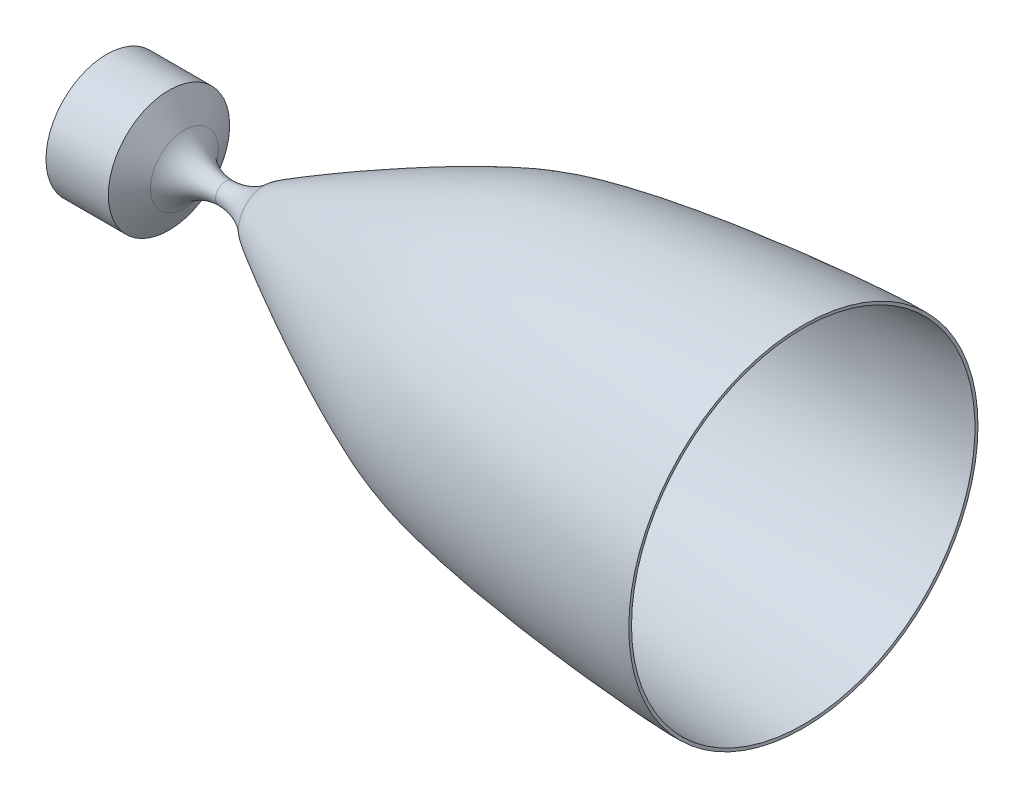
ISO-10303-21;
HEADER;
FILE_DESCRIPTION(('STEP AP214'),'2;1');
FILE_NAME('part.step','',(''),(''),'','','');
FILE_SCHEMA(('AUTOMOTIVE_DESIGN { 1 0 10303 214 1 1 1 1 }'));
ENDSEC;
DATA;
#1=APPLICATION_CONTEXT('core data for automotive mechanical design processes');
#2=APPLICATION_PROTOCOL_DEFINITION('international standard','automotive_design',2000,#1);
#3=PRODUCT_CONTEXT('',#1,'mechanical');
#4=PRODUCT('Part','Part','',(#3));
#5=PRODUCT_RELATED_PRODUCT_CATEGORY('part','',(#4));
#6=PRODUCT_DEFINITION_FORMATION('','',#4);
#7=PRODUCT_DEFINITION_CONTEXT('part definition',#1,'design');
#8=PRODUCT_DEFINITION('design','',#6,#7);
#9=PRODUCT_DEFINITION_SHAPE('','',#8);
#10=(LENGTH_UNIT() NAMED_UNIT(*) SI_UNIT(.MILLI.,.METRE.));
#11=(NAMED_UNIT(*) PLANE_ANGLE_UNIT() SI_UNIT($,.RADIAN.));
#12=(NAMED_UNIT(*) SI_UNIT($,.STERADIAN.) SOLID_ANGLE_UNIT());
#13=UNCERTAINTY_MEASURE_WITH_UNIT(LENGTH_MEASURE(1.E-05),#10,'distance_accuracy_value','');
#14=(GEOMETRIC_REPRESENTATION_CONTEXT(3) GLOBAL_UNCERTAINTY_ASSIGNED_CONTEXT((#13)) GLOBAL_UNIT_ASSIGNED_CONTEXT((#10,
#11,#12)) REPRESENTATION_CONTEXT('',''));
#15=CARTESIAN_POINT('',(0.,0.,0.));
#16=DIRECTION('',(0.,0.,1.));
#17=DIRECTION('',(1.,0.,0.));
#18=AXIS2_PLACEMENT_3D('',#15,#16,#17);
#19=CARTESIAN_POINT('',(-104.819362446718,10.4016129521982,-0.00682647062281705));
#20=CARTESIAN_POINT('',(-103.030535876208,12.1904395227085,-0.00682647062281705));
#21=CARTESIAN_POINT('',(-50.7120404188927,41.7307623696391,-0.00682647062281705));
#22=CARTESIAN_POINT('',(21.1334793033363,68.306603235571,-0.00682647062281705));
#23=CARTESIAN_POINT('',(117.784236763693,74.514625061371,-0.00682647062281705));
#24=CARTESIAN_POINT('',(126.48632550548,74.0001965417168,-0.00682647062281705));
#25=B_SPLINE_CURVE_WITH_KNOTS('',3,(#19,#20,#21,#22,#23,#24),.UNSPECIFIED.,.F.,.F.,(4,1,1,4),
(0.,0.463825258153159,0.563825258153159,1.),.UNSPECIFIED.);
#26=CARTESIAN_POINT('',(-122.41967449452,0.,-0.00682647062281705));
#27=DIRECTION('',(-1.,0.,0.));
#28=AXIS1_PLACEMENT('',#26,#27);
#29=SURFACE_OF_REVOLUTION('',#25,#28);
#30=CARTESIAN_POINT('',(126.48632550548,0.,-0.00682647062281705));
#31=DIRECTION('',(-1.,0.,0.));
#32=DIRECTION('',(0.,0.,1.));
#33=AXIS2_PLACEMENT_3D('',#30,#31,#32);
#34=CIRCLE('',#33,74.0001965417168);
#35=CARTESIAN_POINT('',(126.48632550548,0.,73.993370071094));
#36=VERTEX_POINT('',#35);
#37=EDGE_CURVE('E10',#36,#36,#34,.T.);
#38=ORIENTED_EDGE('',*,*,#37,.F.);
#39=EDGE_LOOP('',(#38));
#40=FACE_BOUND('',#39,.T.);
#41=CARTESIAN_POINT('',(-104.819362446718,0.,-0.00682647062281705));
#42=DIRECTION('',(-1.,0.,0.));
#43=DIRECTION('',(0.,0.,1.));
#44=AXIS2_PLACEMENT_3D('',#41,#42,#43);
#45=CIRCLE('',#44,10.4016129521982);
#46=CARTESIAN_POINT('',(-104.819362446718,0.,10.3947864815753));
#47=VERTEX_POINT('',#46);
#48=EDGE_CURVE('E78',#47,#47,#45,.T.);
#49=ORIENTED_EDGE('',*,*,#48,.T.);
#50=EDGE_LOOP('',(#49));
#51=FACE_BOUND('',#50,.T.);
#52=ADVANCED_FACE('F37',(#40,#51),#29,.T.);
#53=CARTESIAN_POINT('',(126.559768329868,0.,-0.00682647062281705));
#54=DIRECTION('',(1.,0.,0.));
#55=DIRECTION('',(0.,0.,-1.));
#56=AXIS2_PLACEMENT_3D('',#53,#54,#55);
#57=CONICAL_SURFACE('',#56,75.2425576295033,1.51174952321418);
#58=ORIENTED_EDGE('',*,*,#37,.T.);
#59=EDGE_LOOP('',(#58));
#60=FACE_BOUND('',#59,.T.);
#61=CARTESIAN_POINT('',(126.559768329868,0.,-0.00682647062281705));
#62=DIRECTION('',(-1.,0.,0.));
#63=DIRECTION('',(0.,0.,1.));
#64=AXIS2_PLACEMENT_3D('',#61,#62,#63);
#65=CIRCLE('',#64,75.2425576295033);
#66=CARTESIAN_POINT('',(126.559768329868,0.,75.2357311588805));
#67=VERTEX_POINT('',#66);
#68=EDGE_CURVE('E44',#67,#67,#65,.T.);
#69=ORIENTED_EDGE('',*,*,#68,.F.);
#70=EDGE_LOOP('',(#69));
#71=FACE_BOUND('',#70,.T.);
#72=ADVANCED_FACE('F95',(#60,#71),#57,.F.);
#73=CARTESIAN_POINT('',(-105.699378049108,11.2816285545882,-0.00682647062281705));
#74=CARTESIAN_POINT('',(-105.53560430475,11.4454022989468,-0.00682647062281705));
#75=CARTESIAN_POINT('',(-105.406049169845,11.538226175498,-0.00682647062281705));
#76=CARTESIAN_POINT('',(-105.054275376034,11.7930691544197,-0.00682647062281705));
#77=CARTESIAN_POINT('',(-104.844420032022,11.9359369193943,-0.00682647062281705));
#78=CARTESIAN_POINT('',(-104.093090410319,12.4290450422113,-0.00682647062281705));
#79=CARTESIAN_POINT('',(-103.431437659706,12.8419973292261,-0.00682647062281705));
#80=CARTESIAN_POINT('',(-100.979174422802,14.3258551655117,-0.00682647062281705));
#81=CARTESIAN_POINT('',(-98.7244853193859,15.6390993898248,-0.00682647062281705));
#82=CARTESIAN_POINT('',(-90.4370513081206,20.3297007083064,-0.00682647062281705));
#83=CARTESIAN_POINT('',(-82.8843851025847,24.455569333345,-0.00682647062281705));
#84=CARTESIAN_POINT('',(-65.6377591537292,33.445690479554,-0.00682647062281705));
#85=CARTESIAN_POINT('',(-55.9447513733205,38.3094291781832,-0.00682647062281705));
#86=CARTESIAN_POINT('',(-41.2400575868185,45.21025982028,-0.00682647062281705));
#87=CARTESIAN_POINT('',(-36.310942870987,47.4447439954849,-0.00682647062281705));
#88=CARTESIAN_POINT('',(-29.0549175657587,50.5794714256805,-0.00682647062281705));
#89=CARTESIAN_POINT('',(-26.6617075823191,51.5876151131051,-0.00682647062281705));
#90=CARTESIAN_POINT('',(-21.939509352503,53.5145812609791,-0.00682647062281705));
#91=CARTESIAN_POINT('',(-19.5993256927992,54.4356467818305,-0.00682647062281705));
#92=CARTESIAN_POINT('',(-12.4252045597145,57.0856601324914,-0.00682647062281705));
#93=CARTESIAN_POINT('',(-7.43794640202886,58.7008526032758,-0.00682647062281705));
#94=CARTESIAN_POINT('',(4.08598207866587,61.703921853373,-0.00682647062281705));
#95=CARTESIAN_POINT('',(10.6305420679082,63.0908558009443,-0.00682647062281705));
#96=CARTESIAN_POINT('',(31.6815312662527,66.9177586877797,-0.00682647062281705));
#97=CARTESIAN_POINT('',(47.6055202660212,69.0236159479229,-0.00682647062281705));
#98=CARTESIAN_POINT('',(78.1656921124683,72.3434992027354,-0.00682647062281705));
#99=CARTESIAN_POINT('',(92.7997572489254,73.5568857889936,-0.00682647062281705));
#100=CARTESIAN_POINT('',(109.967758740568,74.6999394639008,-0.00682647062281705));
#101=CARTESIAN_POINT('',(114.892701822515,74.968110841481,-0.00682647062281705));
#102=CARTESIAN_POINT('',(120.614090180973,75.2001367882847,-0.00682647062281705));
#103=CARTESIAN_POINT('',(122.243296990861,75.2491310303447,-0.00682647062281705));
#104=CARTESIAN_POINT('',(124.876169851599,75.2899588329945,-0.00682647062281705));
#105=CARTESIAN_POINT('',(125.870400441613,75.283309972162,-0.00682647062281705));
#106=CARTESIAN_POINT('',(126.559768329868,75.2425576295033,-0.00682647062281705));
#107=B_SPLINE_CURVE_WITH_KNOTS('',3,(#73,#74,#75,#76,#77,#78,#79,#80,#81,#82,#83,#84,#85,#86,
#87,#88,#89,#90,#91,#92,#93,#94,#95,#96,#97,#98,#99,#100,#101,#102,#103,#104,#105,#106),
.UNSPECIFIED.,.F.,.F.,(4,2,2,2,2,2,2,2,2,2,2,2,2,2,2,2,4),(0.,0.015625,0.03125,
0.0625000000000001,0.125,0.250000000000001,0.375000000000001,0.437500000000001,
0.468750000000001,0.500000000000002,0.562500000000002,0.625000000000001,0.750000000000001,
0.875000000000001,0.9375,0.96875,1.),.UNSPECIFIED.);
#108=CARTESIAN_POINT('',(-122.41967449452,0.,-0.00682647062281705));
#109=DIRECTION('',(-1.,0.,0.));
#110=AXIS1_PLACEMENT('',#108,#109);
#111=SURFACE_OF_REVOLUTION('',#107,#110);
#112=ORIENTED_EDGE('',*,*,#68,.T.);
#113=EDGE_LOOP('',(#112));
#114=FACE_BOUND('',#113,.T.);
#115=CARTESIAN_POINT('',(-105.699378049108,0.,-0.00682647062281705));
#116=DIRECTION('',(-1.,0.,0.));
#117=DIRECTION('',(0.,0.,1.));
#118=AXIS2_PLACEMENT_3D('',#115,#116,#117);
#119=CIRCLE('',#118,11.2816285545883);
#120=CARTESIAN_POINT('',(-105.699378049108,0.,11.2748020839654));
#121=VERTEX_POINT('',#120);
#122=EDGE_CURVE('E48',#121,#121,#119,.T.);
#123=ORIENTED_EDGE('',*,*,#122,.F.);
#124=EDGE_LOOP('',(#123));
#125=FACE_BOUND('',#124,.T.);
#126=ADVANCED_FACE('F91',(#114,#125),#111,.F.);
#127=CARTESIAN_POINT('',(-122.41967449452,0.,-0.00682647062281705));
#128=DIRECTION('',(-1.,0.,0.));
#129=DIRECTION('',(0.,0.,1.));
#130=AXIS2_PLACEMENT_3D('',#127,#128,#129);
#131=TOROIDAL_SURFACE('',#130,28.001925,23.64607);
#132=ORIENTED_EDGE('',*,*,#122,.T.);
#133=EDGE_LOOP('',(#132));
#134=FACE_BOUND('',#133,.T.);
#135=CARTESIAN_POINT('',(-122.41967449452,0.,-0.00682647062281705));
#136=DIRECTION('',(-1.,0.,0.));
#137=DIRECTION('',(0.,0.,1.));
#138=AXIS2_PLACEMENT_3D('',#135,#136,#137);
#139=CIRCLE('',#138,4.355855);
#140=CARTESIAN_POINT('',(-122.41967449452,0.,4.34902852937719));
#141=VERTEX_POINT('',#140);
#142=EDGE_CURVE('E52',#141,#141,#139,.T.);
#143=ORIENTED_EDGE('',*,*,#142,.F.);
#144=EDGE_LOOP('',(#143));
#145=FACE_BOUND('',#144,.T.);
#146=ADVANCED_FACE('F94',(#134,#145),#131,.F.);
#147=CARTESIAN_POINT('',(-122.41967449452,0.,-0.00682647062281705));
#148=DIRECTION('',(-1.,0.,0.));
#149=DIRECTION('',(0.,0.,1.));
#150=AXIS2_PLACEMENT_3D('',#147,#148,#149);
#151=TOROIDAL_SURFACE('',#150,24.8906,20.534745);
#152=ORIENTED_EDGE('',*,*,#142,.T.);
#153=EDGE_LOOP('',(#152));
#154=FACE_BOUND('',#153,.T.);
#155=CARTESIAN_POINT('',(-140.203285324755,0.,-0.00682647062281705));
#156=DIRECTION('',(-1.,0.,0.));
#157=DIRECTION('',(0.,0.,1.));
#158=AXIS2_PLACEMENT_3D('',#155,#156,#157);
#159=CIRCLE('',#158,14.6232275);
#160=CARTESIAN_POINT('',(-140.203285324755,0.,14.6164010293772));
#161=VERTEX_POINT('',#160);
#162=EDGE_CURVE('E57',#161,#161,#159,.T.);
#163=ORIENTED_EDGE('',*,*,#162,.F.);
#164=EDGE_LOOP('',(#163));
#165=FACE_BOUND('',#164,.T.);
#166=ADVANCED_FACE('F148',(#154,#165),#151,.F.);
#167=CARTESIAN_POINT('',(-146.849685332015,0.,-0.00682647062281705));
#168=DIRECTION('',(-1.,0.,0.));
#169=DIRECTION('',(0.,0.,1.));
#170=AXIS2_PLACEMENT_3D('',#167,#168,#169);
#171=CONICAL_SURFACE('',#170,26.13513,1.0471975511966);
#172=ORIENTED_EDGE('',*,*,#162,.T.);
#173=EDGE_LOOP('',(#172));
#174=FACE_BOUND('',#173,.T.);
#175=CARTESIAN_POINT('',(-146.849685332015,0.,-0.00682647062281705));
#176=DIRECTION('',(-1.,0.,0.));
#177=DIRECTION('',(0.,0.,1.));
#178=AXIS2_PLACEMENT_3D('',#175,#176,#177);
#179=CIRCLE('',#178,26.13513);
#180=CARTESIAN_POINT('',(-146.849685332015,0.,26.1283035293772));
#181=VERTEX_POINT('',#180);
#182=EDGE_CURVE('E60',#181,#181,#179,.T.);
#183=ORIENTED_EDGE('',*,*,#182,.F.);
#184=EDGE_LOOP('',(#183));
#185=FACE_BOUND('',#184,.T.);
#186=ADVANCED_FACE('F145',(#174,#185),#171,.T.);
#187=CARTESIAN_POINT('',(-122.41967449452,0.,-0.00682647062281705));
#188=DIRECTION('',(-1.,0.,0.));
#189=DIRECTION('',(0.,0.,1.));
#190=AXIS2_PLACEMENT_3D('',#187,#188,#189);
#191=CYLINDRICAL_SURFACE('',#190,26.13513);
#192=ORIENTED_EDGE('',*,*,#182,.T.);
#193=EDGE_LOOP('',(#192));
#194=FACE_BOUND('',#193,.T.);
#195=CARTESIAN_POINT('',(-173.70334506253,0.,-0.00682647062281705));
#196=DIRECTION('',(-1.,0.,0.));
#197=DIRECTION('',(0.,0.,1.));
#198=AXIS2_PLACEMENT_3D('',#195,#196,#197);
#199=CIRCLE('',#198,26.13513);
#200=CARTESIAN_POINT('',(-173.70334506253,0.,26.1283035293772));
#201=VERTEX_POINT('',#200);
#202=EDGE_CURVE('E63',#201,#201,#199,.T.);
#203=ORIENTED_EDGE('',*,*,#202,.F.);
#204=EDGE_LOOP('',(#203));
#205=FACE_BOUND('',#204,.T.);
#206=ADVANCED_FACE('F139',(#194,#205),#191,.T.);
#207=CARTESIAN_POINT('',(-173.70334506253,24.8906,-0.00682647062281705));
#208=DIRECTION('',(-1.,0.,0.));
#209=DIRECTION('',(0.,0.,1.));
#210=AXIS2_PLACEMENT_3D('',#207,#208,#209);
#211=PLANE('',#210);
#212=ORIENTED_EDGE('',*,*,#202,.T.);
#213=EDGE_LOOP('',(#212));
#214=FACE_BOUND('',#213,.T.);
#215=ADVANCED_FACE('F134',(#214),#211,.T.);
#216=CARTESIAN_POINT('',(-172.45881506253,24.8906,-0.00682647062281705));
#217=DIRECTION('',(-1.,0.,0.));
#218=DIRECTION('',(0.,0.,1.));
#219=AXIS2_PLACEMENT_3D('',#216,#217,#218);
#220=PLANE('',#219);
#221=CARTESIAN_POINT('',(-172.45881506253,0.,-0.00682647062281705));
#222=DIRECTION('',(-1.,0.,0.));
#223=DIRECTION('',(0.,0.,1.));
#224=AXIS2_PLACEMENT_3D('',#221,#222,#223);
#225=CIRCLE('',#224,24.8906);
#226=CARTESIAN_POINT('',(-172.45881506253,0.,24.8837735293772));
#227=VERTEX_POINT('',#226);
#228=EDGE_CURVE('E66',#227,#227,#225,.T.);
#229=ORIENTED_EDGE('',*,*,#228,.F.);
#230=EDGE_LOOP('',(#229));
#231=FACE_BOUND('',#230,.T.);
#232=ADVANCED_FACE('F129',(#231),#220,.F.);
#233=CARTESIAN_POINT('',(-122.41967449452,0.,-0.00682647062281705));
#234=DIRECTION('',(-1.,0.,0.));
#235=DIRECTION('',(0.,0.,1.));
#236=AXIS2_PLACEMENT_3D('',#233,#234,#235);
#237=CYLINDRICAL_SURFACE('',#236,24.8906);
#238=CARTESIAN_POINT('',(-147.56821506253,0.,-0.00682647062281705));
#239=DIRECTION('',(-1.,0.,0.));
#240=DIRECTION('',(0.,0.,1.));
#241=AXIS2_PLACEMENT_3D('',#238,#239,#240);
#242=CIRCLE('',#241,24.8906);
#243=CARTESIAN_POINT('',(-147.56821506253,0.,24.8837735293772));
#244=VERTEX_POINT('',#243);
#245=EDGE_CURVE('E69',#244,#244,#242,.T.);
#246=ORIENTED_EDGE('',*,*,#245,.F.);
#247=EDGE_LOOP('',(#246));
#248=FACE_BOUND('',#247,.T.);
#249=ORIENTED_EDGE('',*,*,#228,.T.);
#250=EDGE_LOOP('',(#249));
#251=FACE_BOUND('',#250,.T.);
#252=ADVANCED_FACE('F123',(#248,#251),#237,.F.);
#253=CARTESIAN_POINT('',(-147.56821506253,0.,-0.00682647062281705));
#254=DIRECTION('',(-1.,0.,0.));
#255=DIRECTION('',(0.,0.,1.));
#256=AXIS2_PLACEMENT_3D('',#253,#254,#255);
#257=CONICAL_SURFACE('',#256,24.8906,1.0471975511966);
#258=CARTESIAN_POINT('',(-141.281079920527,0.,-0.00682647062281705));
#259=DIRECTION('',(-1.,0.,0.));
#260=DIRECTION('',(0.,0.,1.));
#261=AXIS2_PLACEMENT_3D('',#258,#259,#260);
#262=CIRCLE('',#261,14.0009625);
#263=CARTESIAN_POINT('',(-141.281079920527,0.,13.9941360293772));
#264=VERTEX_POINT('',#263);
#265=EDGE_CURVE('E72',#264,#264,#262,.T.);
#266=ORIENTED_EDGE('',*,*,#265,.F.);
#267=EDGE_LOOP('',(#266));
#268=FACE_BOUND('',#267,.T.);
#269=ORIENTED_EDGE('',*,*,#245,.T.);
#270=EDGE_LOOP('',(#269));
#271=FACE_BOUND('',#270,.T.);
#272=ADVANCED_FACE('F117',(#268,#271),#257,.F.);
#273=CARTESIAN_POINT('',(-122.41967449452,0.,-0.00682647062281705));
#274=DIRECTION('',(-1.,0.,0.));
#275=DIRECTION('',(0.,0.,1.));
#276=AXIS2_PLACEMENT_3D('',#273,#274,#275);
#277=TOROIDAL_SURFACE('',#276,24.8906,21.779275);
#278=CARTESIAN_POINT('',(-122.41967449452,0.,-0.00682647062281705));
#279=DIRECTION('',(-1.,0.,0.));
#280=DIRECTION('',(0.,0.,1.));
#281=AXIS2_PLACEMENT_3D('',#278,#279,#280);
#282=CIRCLE('',#281,3.111325);
#283=CARTESIAN_POINT('',(-122.41967449452,0.,3.10449852937719));
#284=VERTEX_POINT('',#283);
#285=EDGE_CURVE('E75',#284,#284,#282,.T.);
#286=ORIENTED_EDGE('',*,*,#285,.F.);
#287=EDGE_LOOP('',(#286));
#288=FACE_BOUND('',#287,.T.);
#289=ORIENTED_EDGE('',*,*,#265,.T.);
#290=EDGE_LOOP('',(#289));
#291=FACE_BOUND('',#290,.T.);
#292=ADVANCED_FACE('F111',(#288,#291),#277,.T.);
#293=CARTESIAN_POINT('',(-122.41967449452,0.,-0.00682647062281705));
#294=DIRECTION('',(-1.,0.,0.));
#295=DIRECTION('',(0.,0.,1.));
#296=AXIS2_PLACEMENT_3D('',#293,#294,#295);
#297=TOROIDAL_SURFACE('',#296,28.001925,24.8906);
#298=ORIENTED_EDGE('',*,*,#48,.F.);
#299=EDGE_LOOP('',(#298));
#300=FACE_BOUND('',#299,.T.);
#301=ORIENTED_EDGE('',*,*,#285,.T.);
#302=EDGE_LOOP('',(#301));
#303=FACE_BOUND('',#302,.T.);
#304=ADVANCED_FACE('F108',(#300,#303),#297,.T.);
#305=CLOSED_SHELL('',(#52,#72,#126,#146,#166,#186,#206,#215,#232,#252,#272,#292,#304));
#306=MANIFOLD_SOLID_BREP('B2',#305);
#307=ADVANCED_BREP_SHAPE_REPRESENTATION('',(#18,#306),#14);
#308=SHAPE_DEFINITION_REPRESENTATION(#9,#307);
ENDSEC;
END-ISO-10303-21;
